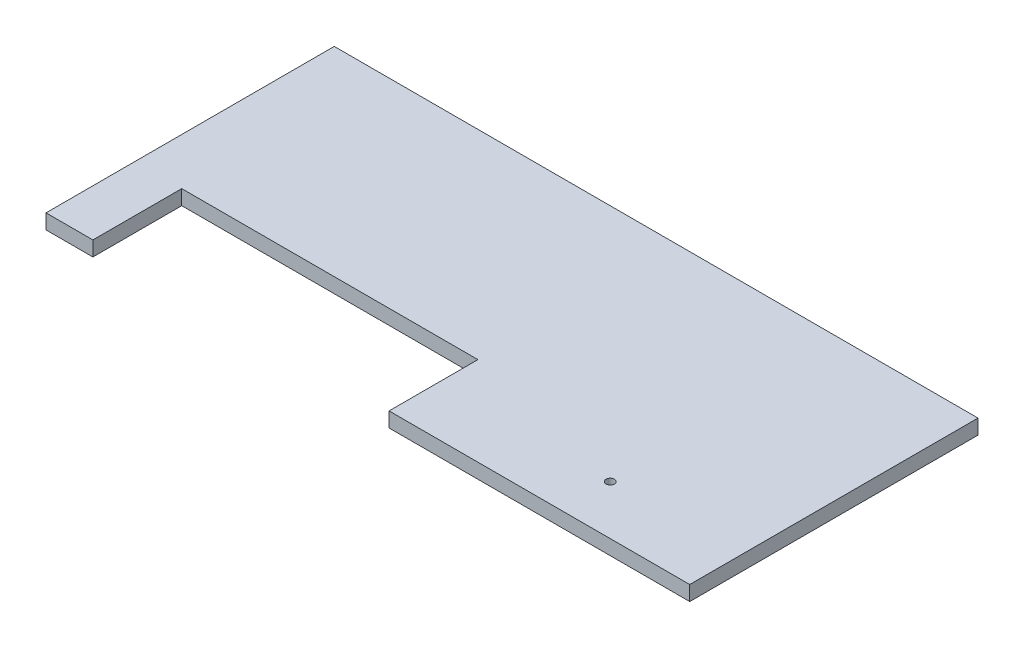
ISO-10303-21;
HEADER;
FILE_DESCRIPTION(('STEP AP214'),'2;1');
FILE_NAME('part.step','',(''),(''),'','','');
FILE_SCHEMA(('AUTOMOTIVE_DESIGN { 1 0 10303 214 1 1 1 1 }'));
ENDSEC;
DATA;
#1=APPLICATION_CONTEXT('core data for automotive mechanical design processes');
#2=APPLICATION_PROTOCOL_DEFINITION('international standard','automotive_design',2000,#1);
#3=PRODUCT_CONTEXT('',#1,'mechanical');
#4=PRODUCT('Part','Part','',(#3));
#5=PRODUCT_RELATED_PRODUCT_CATEGORY('part','',(#4));
#6=PRODUCT_DEFINITION_FORMATION('','',#4);
#7=PRODUCT_DEFINITION_CONTEXT('part definition',#1,'design');
#8=PRODUCT_DEFINITION('design','',#6,#7);
#9=PRODUCT_DEFINITION_SHAPE('','',#8);
#10=(LENGTH_UNIT() NAMED_UNIT(*) SI_UNIT(.MILLI.,.METRE.));
#11=(NAMED_UNIT(*) PLANE_ANGLE_UNIT() SI_UNIT($,.RADIAN.));
#12=(NAMED_UNIT(*) SI_UNIT($,.STERADIAN.) SOLID_ANGLE_UNIT());
#13=UNCERTAINTY_MEASURE_WITH_UNIT(LENGTH_MEASURE(1.E-05),#10,'distance_accuracy_value','');
#14=(GEOMETRIC_REPRESENTATION_CONTEXT(3) GLOBAL_UNCERTAINTY_ASSIGNED_CONTEXT((#13)) GLOBAL_UNIT_ASSIGNED_CONTEXT((#10,
#11,#12)) REPRESENTATION_CONTEXT('',''));
#15=CARTESIAN_POINT('',(0.,0.,0.));
#16=DIRECTION('',(0.,0.,1.));
#17=DIRECTION('',(1.,0.,0.));
#18=AXIS2_PLACEMENT_3D('',#15,#16,#17);
#19=CARTESIAN_POINT('',(0.,3.,40.4));
#20=DIRECTION('',(0.,0.,-1.));
#21=DIRECTION('',(-1.,0.,0.));
#22=AXIS2_PLACEMENT_3D('',#19,#20,#21);
#23=PLANE('',#22);
#24=DIRECTION('',(1.,0.,0.));
#25=VECTOR('',#24,1.);
#26=CARTESIAN_POINT('',(0.,0.,40.4));
#27=LINE('',#26,#25);
#28=CARTESIAN_POINT('',(9.50000000000001,0.,40.4));
#29=VERTEX_POINT('',#28);
#30=CARTESIAN_POINT('',(69.5,0.,40.4));
#31=VERTEX_POINT('',#30);
#32=EDGE_CURVE('E163',#29,#31,#27,.T.);
#33=ORIENTED_EDGE('',*,*,#32,.T.);
#34=DIRECTION('',(0.,-1.,0.));
#35=VECTOR('',#34,1.);
#36=CARTESIAN_POINT('',(69.5,3.,40.4));
#37=LINE('',#36,#35);
#38=CARTESIAN_POINT('',(69.5,3.,40.4));
#39=VERTEX_POINT('',#38);
#40=EDGE_CURVE('E11',#39,#31,#37,.T.);
#41=ORIENTED_EDGE('',*,*,#40,.F.);
#42=DIRECTION('',(1.,0.,0.));
#43=VECTOR('',#42,1.);
#44=CARTESIAN_POINT('',(0.,3.,40.4));
#45=LINE('',#44,#43);
#46=CARTESIAN_POINT('',(9.50000000000001,3.,40.4));
#47=VERTEX_POINT('',#46);
#48=EDGE_CURVE('E151',#47,#39,#45,.T.);
#49=ORIENTED_EDGE('',*,*,#48,.F.);
#50=DIRECTION('',(0.,-1.,0.));
#51=VECTOR('',#50,1.);
#52=CARTESIAN_POINT('',(9.50000000000001,3.,40.4));
#53=LINE('',#52,#51);
#54=EDGE_CURVE('E58',#47,#29,#53,.T.);
#55=ORIENTED_EDGE('',*,*,#54,.T.);
#56=EDGE_LOOP('',(#33,#41,#49,#55));
#57=FACE_BOUND('',#56,.T.);
#58=ADVANCED_FACE('F41',(#57),#23,.F.);
#59=CARTESIAN_POINT('',(69.5,3.,0.));
#60=DIRECTION('',(1.,0.,0.));
#61=DIRECTION('',(0.,0.,-1.));
#62=AXIS2_PLACEMENT_3D('',#59,#60,#61);
#63=PLANE('',#62);
#64=DIRECTION('',(0.,0.,1.));
#65=VECTOR('',#64,1.);
#66=CARTESIAN_POINT('',(69.5,0.,0.));
#67=LINE('',#66,#65);
#68=CARTESIAN_POINT('',(69.5,0.,58.4));
#69=VERTEX_POINT('',#68);
#70=EDGE_CURVE('E167',#31,#69,#67,.T.);
#71=ORIENTED_EDGE('',*,*,#70,.T.);
#72=DIRECTION('',(0.,-1.,0.));
#73=VECTOR('',#72,1.);
#74=CARTESIAN_POINT('',(69.5,3.,58.4));
#75=LINE('',#74,#73);
#76=CARTESIAN_POINT('',(69.5,3.,58.4));
#77=VERTEX_POINT('',#76);
#78=EDGE_CURVE('E50',#77,#69,#75,.T.);
#79=ORIENTED_EDGE('',*,*,#78,.F.);
#80=DIRECTION('',(0.,0.,1.));
#81=VECTOR('',#80,1.);
#82=CARTESIAN_POINT('',(69.5,3.,0.));
#83=LINE('',#82,#81);
#84=EDGE_CURVE('E97',#39,#77,#83,.T.);
#85=ORIENTED_EDGE('',*,*,#84,.F.);
#86=ORIENTED_EDGE('',*,*,#40,.T.);
#87=EDGE_LOOP('',(#71,#79,#85,#86));
#88=FACE_BOUND('',#87,.T.);
#89=ADVANCED_FACE('F230',(#88),#63,.F.);
#90=CARTESIAN_POINT('',(0.,3.,58.4));
#91=DIRECTION('',(0.,0.,-1.));
#92=DIRECTION('',(-1.,0.,0.));
#93=AXIS2_PLACEMENT_3D('',#90,#91,#92);
#94=PLANE('',#93);
#95=DIRECTION('',(1.,0.,0.));
#96=VECTOR('',#95,1.);
#97=CARTESIAN_POINT('',(0.,0.,58.4));
#98=LINE('',#97,#96);
#99=CARTESIAN_POINT('',(130.41,0.,58.4));
#100=VERTEX_POINT('',#99);
#101=EDGE_CURVE('E171',#69,#100,#98,.T.);
#102=ORIENTED_EDGE('',*,*,#101,.T.);
#103=DIRECTION('',(0.,-1.,0.));
#104=VECTOR('',#103,1.);
#105=CARTESIAN_POINT('',(130.41,3.,58.4));
#106=LINE('',#105,#104);
#107=CARTESIAN_POINT('',(130.41,3.,58.4));
#108=VERTEX_POINT('',#107);
#109=EDGE_CURVE('E200',#108,#100,#106,.T.);
#110=ORIENTED_EDGE('',*,*,#109,.F.);
#111=DIRECTION('',(1.,0.,0.));
#112=VECTOR('',#111,1.);
#113=CARTESIAN_POINT('',(0.,3.,58.4));
#114=LINE('',#113,#112);
#115=EDGE_CURVE('E139',#77,#108,#114,.T.);
#116=ORIENTED_EDGE('',*,*,#115,.F.);
#117=ORIENTED_EDGE('',*,*,#78,.T.);
#118=EDGE_LOOP('',(#102,#110,#116,#117));
#119=FACE_BOUND('',#118,.T.);
#120=ADVANCED_FACE('F206',(#119),#94,.F.);
#121=CARTESIAN_POINT('',(130.41,3.,0.));
#122=DIRECTION('',(1.,0.,0.));
#123=DIRECTION('',(0.,0.,-1.));
#124=AXIS2_PLACEMENT_3D('',#121,#122,#123);
#125=PLANE('',#124);
#126=DIRECTION('',(0.,0.,1.));
#127=VECTOR('',#126,1.);
#128=CARTESIAN_POINT('',(130.41,0.,0.));
#129=LINE('',#128,#127);
#130=CARTESIAN_POINT('',(130.41,0.,0.));
#131=VERTEX_POINT('',#130);
#132=EDGE_CURVE('E177',#131,#100,#129,.T.);
#133=ORIENTED_EDGE('',*,*,#132,.F.);
#134=DIRECTION('',(0.,-1.,0.));
#135=VECTOR('',#134,1.);
#136=CARTESIAN_POINT('',(130.41,3.,0.));
#137=LINE('',#136,#135);
#138=CARTESIAN_POINT('',(130.41,3.,0.));
#139=VERTEX_POINT('',#138);
#140=EDGE_CURVE('E197',#139,#131,#137,.T.);
#141=ORIENTED_EDGE('',*,*,#140,.F.);
#142=DIRECTION('',(0.,0.,1.));
#143=VECTOR('',#142,1.);
#144=CARTESIAN_POINT('',(130.41,3.,0.));
#145=LINE('',#144,#143);
#146=EDGE_CURVE('E145',#139,#108,#145,.T.);
#147=ORIENTED_EDGE('',*,*,#146,.T.);
#148=ORIENTED_EDGE('',*,*,#109,.T.);
#149=EDGE_LOOP('',(#133,#141,#147,#148));
#150=FACE_BOUND('',#149,.T.);
#151=ADVANCED_FACE('F212',(#150),#125,.T.);
#152=CARTESIAN_POINT('',(0.,3.,0.));
#153=DIRECTION('',(0.,0.,-1.));
#154=DIRECTION('',(-1.,0.,0.));
#155=AXIS2_PLACEMENT_3D('',#152,#153,#154);
#156=PLANE('',#155);
#157=DIRECTION('',(1.,0.,0.));
#158=VECTOR('',#157,1.);
#159=CARTESIAN_POINT('',(0.,0.,0.));
#160=LINE('',#159,#158);
#161=CARTESIAN_POINT('',(0.,0.,0.));
#162=VERTEX_POINT('',#161);
#163=EDGE_CURVE('E182',#162,#131,#160,.T.);
#164=ORIENTED_EDGE('',*,*,#163,.F.);
#165=DIRECTION('',(0.,-1.,0.));
#166=VECTOR('',#165,1.);
#167=CARTESIAN_POINT('',(0.,3.,0.));
#168=LINE('',#167,#166);
#169=CARTESIAN_POINT('',(0.,3.,0.));
#170=VERTEX_POINT('',#169);
#171=EDGE_CURVE('E133',#170,#162,#168,.T.);
#172=ORIENTED_EDGE('',*,*,#171,.F.);
#173=DIRECTION('',(1.,0.,0.));
#174=VECTOR('',#173,1.);
#175=CARTESIAN_POINT('',(0.,3.,0.));
#176=LINE('',#175,#174);
#177=EDGE_CURVE('E121',#170,#139,#176,.T.);
#178=ORIENTED_EDGE('',*,*,#177,.T.);
#179=ORIENTED_EDGE('',*,*,#140,.T.);
#180=EDGE_LOOP('',(#164,#172,#178,#179));
#181=FACE_BOUND('',#180,.T.);
#182=ADVANCED_FACE('F214',(#181),#156,.T.);
#183=CARTESIAN_POINT('',(0.,3.,0.));
#184=DIRECTION('',(1.,0.,0.));
#185=DIRECTION('',(0.,0.,-1.));
#186=AXIS2_PLACEMENT_3D('',#183,#184,#185);
#187=PLANE('',#186);
#188=DIRECTION('',(0.,0.,1.));
#189=VECTOR('',#188,1.);
#190=CARTESIAN_POINT('',(0.,0.,0.));
#191=LINE('',#190,#189);
#192=CARTESIAN_POINT('',(0.,0.,58.4));
#193=VERTEX_POINT('',#192);
#194=EDGE_CURVE('E129',#162,#193,#191,.T.);
#195=ORIENTED_EDGE('',*,*,#194,.T.);
#196=DIRECTION('',(0.,-1.,0.));
#197=VECTOR('',#196,1.);
#198=CARTESIAN_POINT('',(0.,3.,58.4));
#199=LINE('',#198,#197);
#200=CARTESIAN_POINT('',(0.,3.,58.4));
#201=VERTEX_POINT('',#200);
#202=EDGE_CURVE('E126',#201,#193,#199,.T.);
#203=ORIENTED_EDGE('',*,*,#202,.F.);
#204=DIRECTION('',(0.,0.,1.));
#205=VECTOR('',#204,1.);
#206=CARTESIAN_POINT('',(0.,3.,0.));
#207=LINE('',#206,#205);
#208=EDGE_CURVE('E113',#170,#201,#207,.T.);
#209=ORIENTED_EDGE('',*,*,#208,.F.);
#210=ORIENTED_EDGE('',*,*,#171,.T.);
#211=EDGE_LOOP('',(#195,#203,#209,#210));
#212=FACE_BOUND('',#211,.T.);
#213=ADVANCED_FACE('F127',(#212),#187,.F.);
#214=CARTESIAN_POINT('',(9.50000000000001,0.,58.4));
#215=VERTEX_POINT('',#214);
#216=EDGE_CURVE('E178',#193,#215,#98,.T.);
#217=ORIENTED_EDGE('',*,*,#216,.T.);
#218=DIRECTION('',(0.,-1.,0.));
#219=VECTOR('',#218,1.);
#220=CARTESIAN_POINT('',(9.50000000000001,3.,58.4));
#221=LINE('',#220,#219);
#222=CARTESIAN_POINT('',(9.50000000000001,3.,58.4));
#223=VERTEX_POINT('',#222);
#224=EDGE_CURVE('E85',#223,#215,#221,.T.);
#225=ORIENTED_EDGE('',*,*,#224,.F.);
#226=EDGE_CURVE('E118',#201,#223,#114,.T.);
#227=ORIENTED_EDGE('',*,*,#226,.F.);
#228=ORIENTED_EDGE('',*,*,#202,.T.);
#229=EDGE_LOOP('',(#217,#225,#227,#228));
#230=FACE_BOUND('',#229,.T.);
#231=ADVANCED_FACE('F135',(#230),#94,.F.);
#232=CARTESIAN_POINT('',(9.5,3.,0.));
#233=DIRECTION('',(1.,0.,0.));
#234=DIRECTION('',(0.,0.,-1.));
#235=AXIS2_PLACEMENT_3D('',#232,#233,#234);
#236=PLANE('',#235);
#237=DIRECTION('',(0.,0.,1.));
#238=VECTOR('',#237,1.);
#239=CARTESIAN_POINT('',(9.5,0.,0.));
#240=LINE('',#239,#238);
#241=EDGE_CURVE('E153',#29,#215,#240,.T.);
#242=ORIENTED_EDGE('',*,*,#241,.F.);
#243=ORIENTED_EDGE('',*,*,#54,.F.);
#244=DIRECTION('',(0.,0.,1.));
#245=VECTOR('',#244,1.);
#246=CARTESIAN_POINT('',(9.5,3.,0.));
#247=LINE('',#246,#245);
#248=EDGE_CURVE('E137',#47,#223,#247,.T.);
#249=ORIENTED_EDGE('',*,*,#248,.T.);
#250=ORIENTED_EDGE('',*,*,#224,.T.);
#251=EDGE_LOOP('',(#242,#243,#249,#250));
#252=FACE_BOUND('',#251,.T.);
#253=ADVANCED_FACE('F218',(#252),#236,.T.);
#254=CARTESIAN_POINT('',(0.,3.,0.));
#255=DIRECTION('',(0.,1.,0.));
#256=DIRECTION('',(0.,0.,1.));
#257=AXIS2_PLACEMENT_3D('',#254,#255,#256);
#258=PLANE('',#257);
#259=CARTESIAN_POINT('',(104.3,3.,48.4));
#260=DIRECTION('',(0.,1.,0.));
#261=DIRECTION('',(0.,0.,1.));
#262=AXIS2_PLACEMENT_3D('',#259,#260,#261);
#263=CIRCLE('',#262,0.850000000000007);
#264=CARTESIAN_POINT('',(104.3,3.,49.25));
#265=VERTEX_POINT('',#264);
#266=EDGE_CURVE('E156',#265,#265,#263,.T.);
#267=ORIENTED_EDGE('',*,*,#266,.F.);
#268=EDGE_LOOP('',(#267));
#269=FACE_BOUND('',#268,.T.);
#270=ORIENTED_EDGE('',*,*,#48,.T.);
#271=ORIENTED_EDGE('',*,*,#84,.T.);
#272=ORIENTED_EDGE('',*,*,#115,.T.);
#273=ORIENTED_EDGE('',*,*,#146,.F.);
#274=ORIENTED_EDGE('',*,*,#177,.F.);
#275=ORIENTED_EDGE('',*,*,#208,.T.);
#276=ORIENTED_EDGE('',*,*,#226,.T.);
#277=ORIENTED_EDGE('',*,*,#248,.F.);
#278=EDGE_LOOP('',(#270,#271,#272,#273,#274,#275,#276,#277));
#279=FACE_BOUND('',#278,.T.);
#280=ADVANCED_FACE('F115',(#269,#279),#258,.T.);
#281=CARTESIAN_POINT('',(0.,0.,0.));
#282=DIRECTION('',(0.,1.,0.));
#283=DIRECTION('',(0.,0.,1.));
#284=AXIS2_PLACEMENT_3D('',#281,#282,#283);
#285=PLANE('',#284);
#286=CARTESIAN_POINT('',(104.3,0.,48.4));
#287=DIRECTION('',(0.,1.,0.));
#288=DIRECTION('',(0.,0.,1.));
#289=AXIS2_PLACEMENT_3D('',#286,#287,#288);
#290=CIRCLE('',#289,0.850000000000007);
#291=CARTESIAN_POINT('',(104.3,0.,49.25));
#292=VERTEX_POINT('',#291);
#293=EDGE_CURVE('E160',#292,#292,#290,.T.);
#294=ORIENTED_EDGE('',*,*,#293,.T.);
#295=EDGE_LOOP('',(#294));
#296=FACE_BOUND('',#295,.T.);
#297=ORIENTED_EDGE('',*,*,#32,.F.);
#298=ORIENTED_EDGE('',*,*,#241,.T.);
#299=ORIENTED_EDGE('',*,*,#216,.F.);
#300=ORIENTED_EDGE('',*,*,#194,.F.);
#301=ORIENTED_EDGE('',*,*,#163,.T.);
#302=ORIENTED_EDGE('',*,*,#132,.T.);
#303=ORIENTED_EDGE('',*,*,#101,.F.);
#304=ORIENTED_EDGE('',*,*,#70,.F.);
#305=EDGE_LOOP('',(#297,#298,#299,#300,#301,#302,#303,#304));
#306=FACE_BOUND('',#305,.T.);
#307=ADVANCED_FACE('F208',(#296,#306),#285,.F.);
#308=CARTESIAN_POINT('',(104.3,0.,48.4));
#309=DIRECTION('',(0.,1.,0.));
#310=DIRECTION('',(0.,0.,1.));
#311=AXIS2_PLACEMENT_3D('',#308,#309,#310);
#312=CYLINDRICAL_SURFACE('',#311,0.850000000000007);
#313=ORIENTED_EDGE('',*,*,#293,.F.);
#314=EDGE_LOOP('',(#313));
#315=FACE_BOUND('',#314,.T.);
#316=ORIENTED_EDGE('',*,*,#266,.T.);
#317=EDGE_LOOP('',(#316));
#318=FACE_BOUND('',#317,.T.);
#319=ADVANCED_FACE('F270',(#315,#318),#312,.F.);
#320=CLOSED_SHELL('',(#58,#89,#120,#151,#182,#213,#231,#253,#280,#307,#319));
#321=MANIFOLD_SOLID_BREP('B2',#320);
#322=ADVANCED_BREP_SHAPE_REPRESENTATION('',(#18,#321),#14);
#323=SHAPE_DEFINITION_REPRESENTATION(#9,#322);
ENDSEC;
END-ISO-10303-21;
